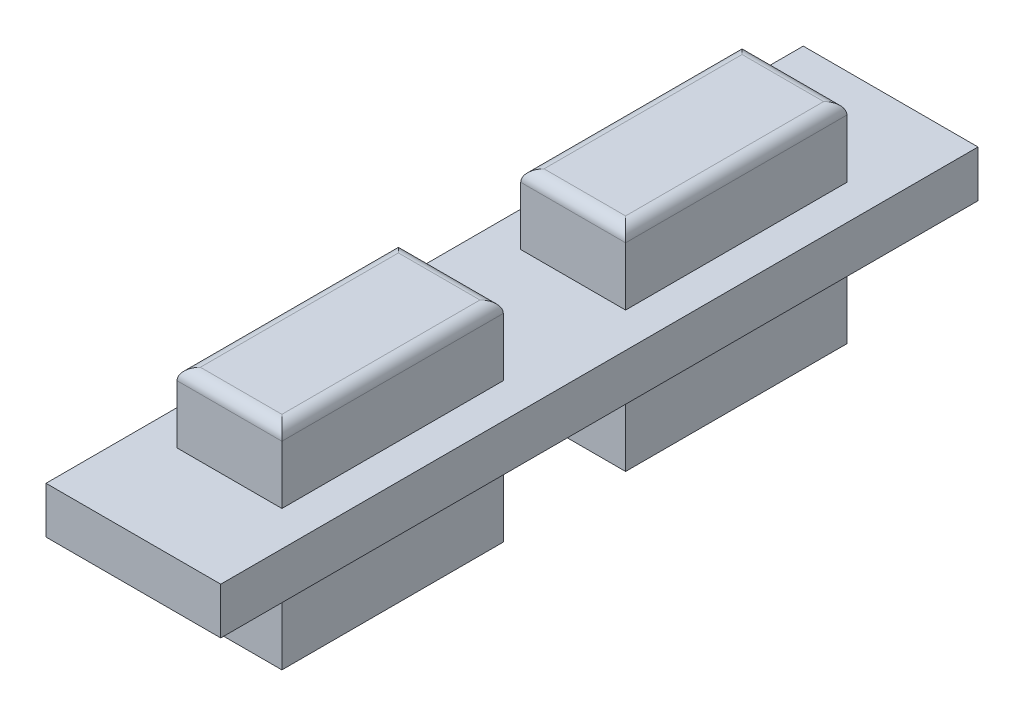
ISO-10303-21;
HEADER;
FILE_DESCRIPTION(('STEP AP214'),'2;1');
FILE_NAME('part.step','',(''),(''),'','','');
FILE_SCHEMA(('AUTOMOTIVE_DESIGN { 1 0 10303 214 1 1 1 1 }'));
ENDSEC;
DATA;
#1=APPLICATION_CONTEXT('core data for automotive mechanical design processes');
#2=APPLICATION_PROTOCOL_DEFINITION('international standard','automotive_design',2000,#1);
#3=PRODUCT_CONTEXT('',#1,'mechanical');
#4=PRODUCT('Part','Part','',(#3));
#5=PRODUCT_RELATED_PRODUCT_CATEGORY('part','',(#4));
#6=PRODUCT_DEFINITION_FORMATION('','',#4);
#7=PRODUCT_DEFINITION_CONTEXT('part definition',#1,'design');
#8=PRODUCT_DEFINITION('design','',#6,#7);
#9=PRODUCT_DEFINITION_SHAPE('','',#8);
#10=(LENGTH_UNIT() NAMED_UNIT(*) SI_UNIT(.MILLI.,.METRE.));
#11=(NAMED_UNIT(*) PLANE_ANGLE_UNIT() SI_UNIT($,.RADIAN.));
#12=(NAMED_UNIT(*) SI_UNIT($,.STERADIAN.) SOLID_ANGLE_UNIT());
#13=UNCERTAINTY_MEASURE_WITH_UNIT(LENGTH_MEASURE(1.E-05),#10,'distance_accuracy_value','');
#14=(GEOMETRIC_REPRESENTATION_CONTEXT(3) GLOBAL_UNCERTAINTY_ASSIGNED_CONTEXT((#13)) GLOBAL_UNIT_ASSIGNED_CONTEXT((#10,
#11,#12)) REPRESENTATION_CONTEXT('',''));
#15=CARTESIAN_POINT('',(0.,0.,0.));
#16=DIRECTION('',(0.,0.,1.));
#17=DIRECTION('',(1.,0.,0.));
#18=AXIS2_PLACEMENT_3D('',#15,#16,#17);
#19=CARTESIAN_POINT('',(0.,2.54,0.));
#20=DIRECTION('',(0.,-1.,0.));
#21=DIRECTION('',(0.,0.,-1.));
#22=AXIS2_PLACEMENT_3D('',#19,#20,#21);
#23=PLANE('',#22);
#24=DIRECTION('',(0.,0.,-1.));
#25=VECTOR('',#24,1.);
#26=CARTESIAN_POINT('',(-20.2947526934332,2.54,0.));
#27=LINE('',#26,#25);
#28=CARTESIAN_POINT('',(-20.2947526934332,2.54,15.5380927525385));
#29=VERTEX_POINT('',#28);
#30=CARTESIAN_POINT('',(-20.2947526934332,2.54,10.7120927525385));
#31=VERTEX_POINT('',#30);
#32=EDGE_CURVE('E267',#29,#31,#27,.T.);
#33=ORIENTED_EDGE('',*,*,#32,.T.);
#34=DIRECTION('',(-1.,0.,0.));
#35=VECTOR('',#34,1.);
#36=CARTESIAN_POINT('',(0.,2.54,10.7120927525385));
#37=LINE('',#36,#35);
#38=CARTESIAN_POINT('',(-22.5807526934332,2.54,10.7120927525385));
#39=VERTEX_POINT('',#38);
#40=EDGE_CURVE('E269',#31,#39,#37,.T.);
#41=ORIENTED_EDGE('',*,*,#40,.T.);
#42=DIRECTION('',(0.,0.,-1.));
#43=VECTOR('',#42,1.);
#44=CARTESIAN_POINT('',(-22.5807526934332,2.54,0.));
#45=LINE('',#44,#43);
#46=CARTESIAN_POINT('',(-22.5807526934332,2.54,15.5380927525385));
#47=VERTEX_POINT('',#46);
#48=EDGE_CURVE('E261',#47,#39,#45,.T.);
#49=ORIENTED_EDGE('',*,*,#48,.F.);
#50=DIRECTION('',(-1.,0.,0.));
#51=VECTOR('',#50,1.);
#52=CARTESIAN_POINT('',(0.,2.54,15.5380927525385));
#53=LINE('',#52,#51);
#54=EDGE_CURVE('E264',#29,#47,#53,.T.);
#55=ORIENTED_EDGE('',*,*,#54,.F.);
#56=EDGE_LOOP('',(#33,#41,#49,#55));
#57=FACE_BOUND('',#56,.T.);
#58=DIRECTION('',(1.,0.,0.));
#59=VECTOR('',#58,1.);
#60=CARTESIAN_POINT('',(-23.3427526934332,2.54,1.12359275253847));
#61=LINE('',#60,#59);
#62=CARTESIAN_POINT('',(-23.3427526934332,2.54,1.12359275253847));
#63=VERTEX_POINT('',#62);
#64=CARTESIAN_POINT('',(-19.5327526934332,2.54,1.12359275253847));
#65=VERTEX_POINT('',#64);
#66=EDGE_CURVE('E283',#63,#65,#61,.T.);
#67=ORIENTED_EDGE('',*,*,#66,.T.);
#68=DIRECTION('',(0.,0.,1.));
#69=VECTOR('',#68,1.);
#70=CARTESIAN_POINT('',(-19.5327526934332,2.54,1.12359275253847));
#71=LINE('',#70,#69);
#72=CARTESIAN_POINT('',(-19.5327526934332,2.54,17.6335927525385));
#73=VERTEX_POINT('',#72);
#74=EDGE_CURVE('E286',#65,#73,#71,.T.);
#75=ORIENTED_EDGE('',*,*,#74,.T.);
#76=DIRECTION('',(1.,0.,0.));
#77=VECTOR('',#76,1.);
#78=CARTESIAN_POINT('',(-23.3427526934332,2.54,17.6335927525385));
#79=LINE('',#78,#77);
#80=CARTESIAN_POINT('',(-23.3427526934332,2.54,17.6335927525385));
#81=VERTEX_POINT('',#80);
#82=EDGE_CURVE('E288',#81,#73,#79,.T.);
#83=ORIENTED_EDGE('',*,*,#82,.F.);
#84=DIRECTION('',(0.,0.,1.));
#85=VECTOR('',#84,1.);
#86=CARTESIAN_POINT('',(-23.3427526934332,2.54,1.12359275253847));
#87=LINE('',#86,#85);
#88=EDGE_CURVE('E291',#63,#81,#87,.T.);
#89=ORIENTED_EDGE('',*,*,#88,.F.);
#90=EDGE_LOOP('',(#67,#75,#83,#89));
#91=FACE_BOUND('',#90,.T.);
#92=DIRECTION('',(0.,0.,-1.));
#93=VECTOR('',#92,1.);
#94=CARTESIAN_POINT('',(-20.2947526934332,2.54,0.));
#95=LINE('',#94,#93);
#96=CARTESIAN_POINT('',(-20.2947526934332,2.54,8.04509275253847));
#97=VERTEX_POINT('',#96);
#98=CARTESIAN_POINT('',(-20.2947526934332,2.54,3.21909275253847));
#99=VERTEX_POINT('',#98);
#100=EDGE_CURVE('E230',#97,#99,#95,.T.);
#101=ORIENTED_EDGE('',*,*,#100,.T.);
#102=DIRECTION('',(-1.,0.,0.));
#103=VECTOR('',#102,1.);
#104=CARTESIAN_POINT('',(0.,2.54,3.21909275253847));
#105=LINE('',#104,#103);
#106=CARTESIAN_POINT('',(-22.5807526934332,2.54,3.21909275253847));
#107=VERTEX_POINT('',#106);
#108=EDGE_CURVE('E232',#99,#107,#105,.T.);
#109=ORIENTED_EDGE('',*,*,#108,.T.);
#110=DIRECTION('',(0.,0.,-1.));
#111=VECTOR('',#110,1.);
#112=CARTESIAN_POINT('',(-22.5807526934332,2.54,0.));
#113=LINE('',#112,#111);
#114=CARTESIAN_POINT('',(-22.5807526934332,2.54,8.04509275253847));
#115=VERTEX_POINT('',#114);
#116=EDGE_CURVE('E203',#115,#107,#113,.T.);
#117=ORIENTED_EDGE('',*,*,#116,.F.);
#118=DIRECTION('',(-1.,0.,0.));
#119=VECTOR('',#118,1.);
#120=CARTESIAN_POINT('',(0.,2.54,8.04509275253847));
#121=LINE('',#120,#119);
#122=EDGE_CURVE('E227',#97,#115,#121,.T.);
#123=ORIENTED_EDGE('',*,*,#122,.F.);
#124=EDGE_LOOP('',(#101,#109,#117,#123));
#125=FACE_BOUND('',#124,.T.);
#126=ADVANCED_FACE('F33',(#57,#91,#125),#23,.T.);
#127=CARTESIAN_POINT('',(0.,3.556,0.));
#128=DIRECTION('',(0.,-1.,0.));
#129=DIRECTION('',(0.,0.,-1.));
#130=AXIS2_PLACEMENT_3D('',#127,#128,#129);
#131=PLANE('',#130);
#132=DIRECTION('',(-1.,0.,0.));
#133=VECTOR('',#132,1.);
#134=CARTESIAN_POINT('',(0.,3.556,10.7120927525385));
#135=LINE('',#134,#133);
#136=CARTESIAN_POINT('',(-20.2947526934332,3.556,10.7120927525385));
#137=VERTEX_POINT('',#136);
#138=CARTESIAN_POINT('',(-22.5807526934332,3.556,10.7120927525385));
#139=VERTEX_POINT('',#138);
#140=EDGE_CURVE('E310',#137,#139,#135,.T.);
#141=ORIENTED_EDGE('',*,*,#140,.F.);
#142=DIRECTION('',(0.,0.,-1.));
#143=VECTOR('',#142,1.);
#144=CARTESIAN_POINT('',(-20.2947526934332,3.556,0.));
#145=LINE('',#144,#143);
#146=CARTESIAN_POINT('',(-20.2947526934332,3.556,15.5380927525385));
#147=VERTEX_POINT('',#146);
#148=EDGE_CURVE('E308',#147,#137,#145,.T.);
#149=ORIENTED_EDGE('',*,*,#148,.F.);
#150=DIRECTION('',(-1.,0.,0.));
#151=VECTOR('',#150,1.);
#152=CARTESIAN_POINT('',(0.,3.556,15.5380927525385));
#153=LINE('',#152,#151);
#154=CARTESIAN_POINT('',(-22.5807526934332,3.556,15.5380927525385));
#155=VERTEX_POINT('',#154);
#156=EDGE_CURVE('E305',#147,#155,#153,.T.);
#157=ORIENTED_EDGE('',*,*,#156,.T.);
#158=DIRECTION('',(0.,0.,-1.));
#159=VECTOR('',#158,1.);
#160=CARTESIAN_POINT('',(-22.5807526934332,3.556,0.));
#161=LINE('',#160,#159);
#162=EDGE_CURVE('E302',#155,#139,#161,.T.);
#163=ORIENTED_EDGE('',*,*,#162,.T.);
#164=EDGE_LOOP('',(#141,#149,#157,#163));
#165=FACE_BOUND('',#164,.T.);
#166=DIRECTION('',(1.,0.,0.));
#167=VECTOR('',#166,1.);
#168=CARTESIAN_POINT('',(-23.3427526934332,3.556,1.12359275253847));
#169=LINE('',#168,#167);
#170=CARTESIAN_POINT('',(-23.3427526934332,3.556,1.12359275253847));
#171=VERTEX_POINT('',#170);
#172=CARTESIAN_POINT('',(-19.5327526934332,3.556,1.12359275253847));
#173=VERTEX_POINT('',#172);
#174=EDGE_CURVE('E271',#171,#173,#169,.T.);
#175=ORIENTED_EDGE('',*,*,#174,.F.);
#176=DIRECTION('',(0.,0.,1.));
#177=VECTOR('',#176,1.);
#178=CARTESIAN_POINT('',(-23.3427526934332,3.556,1.12359275253847));
#179=LINE('',#178,#177);
#180=CARTESIAN_POINT('',(-23.3427526934332,3.556,17.6335927525385));
#181=VERTEX_POINT('',#180);
#182=EDGE_CURVE('E280',#171,#181,#179,.T.);
#183=ORIENTED_EDGE('',*,*,#182,.T.);
#184=DIRECTION('',(1.,0.,0.));
#185=VECTOR('',#184,1.);
#186=CARTESIAN_POINT('',(-23.3427526934332,3.556,17.6335927525385));
#187=LINE('',#186,#185);
#188=CARTESIAN_POINT('',(-19.5327526934332,3.556,17.6335927525385));
#189=VERTEX_POINT('',#188);
#190=EDGE_CURVE('E277',#181,#189,#187,.T.);
#191=ORIENTED_EDGE('',*,*,#190,.T.);
#192=DIRECTION('',(0.,0.,1.));
#193=VECTOR('',#192,1.);
#194=CARTESIAN_POINT('',(-19.5327526934332,3.556,1.12359275253847));
#195=LINE('',#194,#193);
#196=EDGE_CURVE('E274',#173,#189,#195,.T.);
#197=ORIENTED_EDGE('',*,*,#196,.F.);
#198=EDGE_LOOP('',(#175,#183,#191,#197));
#199=FACE_BOUND('',#198,.T.);
#200=DIRECTION('',(-1.,0.,0.));
#201=VECTOR('',#200,1.);
#202=CARTESIAN_POINT('',(0.,3.556,3.21909275253847));
#203=LINE('',#202,#201);
#204=CARTESIAN_POINT('',(-20.2947526934332,3.556,3.21909275253847));
#205=VERTEX_POINT('',#204);
#206=CARTESIAN_POINT('',(-22.5807526934332,3.556,3.21909275253847));
#207=VERTEX_POINT('',#206);
#208=EDGE_CURVE('E321',#205,#207,#203,.T.);
#209=ORIENTED_EDGE('',*,*,#208,.F.);
#210=DIRECTION('',(0.,0.,-1.));
#211=VECTOR('',#210,1.);
#212=CARTESIAN_POINT('',(-20.2947526934332,3.556,0.));
#213=LINE('',#212,#211);
#214=CARTESIAN_POINT('',(-20.2947526934332,3.556,8.04509275253847));
#215=VERTEX_POINT('',#214);
#216=EDGE_CURVE('E319',#215,#205,#213,.T.);
#217=ORIENTED_EDGE('',*,*,#216,.F.);
#218=DIRECTION('',(-1.,0.,0.));
#219=VECTOR('',#218,1.);
#220=CARTESIAN_POINT('',(0.,3.556,8.04509275253847));
#221=LINE('',#220,#219);
#222=CARTESIAN_POINT('',(-22.5807526934332,3.556,8.04509275253847));
#223=VERTEX_POINT('',#222);
#224=EDGE_CURVE('E316',#215,#223,#221,.T.);
#225=ORIENTED_EDGE('',*,*,#224,.T.);
#226=DIRECTION('',(0.,0.,-1.));
#227=VECTOR('',#226,1.);
#228=CARTESIAN_POINT('',(-22.5807526934332,3.556,0.));
#229=LINE('',#228,#227);
#230=EDGE_CURVE('E313',#223,#207,#229,.T.);
#231=ORIENTED_EDGE('',*,*,#230,.T.);
#232=EDGE_LOOP('',(#209,#217,#225,#231));
#233=FACE_BOUND('',#232,.T.);
#234=ADVANCED_FACE('F401',(#165,#199,#233),#131,.F.);
#235=CARTESIAN_POINT('',(-23.3427526934332,2.54,1.12359275253847));
#236=DIRECTION('',(0.,0.,1.));
#237=DIRECTION('',(1.,0.,0.));
#238=AXIS2_PLACEMENT_3D('',#235,#236,#237);
#239=PLANE('',#238);
#240=DIRECTION('',(0.,1.,0.));
#241=VECTOR('',#240,1.);
#242=CARTESIAN_POINT('',(-23.3427526934332,2.54,1.12359275253847));
#243=LINE('',#242,#241);
#244=EDGE_CURVE('E294',#63,#171,#243,.T.);
#245=ORIENTED_EDGE('',*,*,#244,.T.);
#246=ORIENTED_EDGE('',*,*,#174,.T.);
#247=DIRECTION('',(0.,1.,0.));
#248=VECTOR('',#247,1.);
#249=CARTESIAN_POINT('',(-19.5327526934332,2.54,1.12359275253847));
#250=LINE('',#249,#248);
#251=EDGE_CURVE('E300',#65,#173,#250,.T.);
#252=ORIENTED_EDGE('',*,*,#251,.F.);
#253=ORIENTED_EDGE('',*,*,#66,.F.);
#254=EDGE_LOOP('',(#245,#246,#252,#253));
#255=FACE_BOUND('',#254,.T.);
#256=ADVANCED_FACE('F427',(#255),#239,.F.);
#257=CARTESIAN_POINT('',(-19.5327526934332,2.54,1.12359275253847));
#258=DIRECTION('',(-1.,0.,0.));
#259=DIRECTION('',(0.,0.,1.));
#260=AXIS2_PLACEMENT_3D('',#257,#258,#259);
#261=PLANE('',#260);
#262=ORIENTED_EDGE('',*,*,#251,.T.);
#263=ORIENTED_EDGE('',*,*,#196,.T.);
#264=DIRECTION('',(0.,1.,0.));
#265=VECTOR('',#264,1.);
#266=CARTESIAN_POINT('',(-19.5327526934332,2.54,17.6335927525385));
#267=LINE('',#266,#265);
#268=EDGE_CURVE('E298',#73,#189,#267,.T.);
#269=ORIENTED_EDGE('',*,*,#268,.F.);
#270=ORIENTED_EDGE('',*,*,#74,.F.);
#271=EDGE_LOOP('',(#262,#263,#269,#270));
#272=FACE_BOUND('',#271,.T.);
#273=ADVANCED_FACE('F438',(#272),#261,.F.);
#274=CARTESIAN_POINT('',(-23.3427526934332,2.54,17.6335927525385));
#275=DIRECTION('',(0.,0.,1.));
#276=DIRECTION('',(1.,0.,0.));
#277=AXIS2_PLACEMENT_3D('',#274,#275,#276);
#278=PLANE('',#277);
#279=ORIENTED_EDGE('',*,*,#268,.T.);
#280=ORIENTED_EDGE('',*,*,#190,.F.);
#281=DIRECTION('',(0.,1.,0.));
#282=VECTOR('',#281,1.);
#283=CARTESIAN_POINT('',(-23.3427526934332,2.54,17.6335927525385));
#284=LINE('',#283,#282);
#285=EDGE_CURVE('E296',#81,#181,#284,.T.);
#286=ORIENTED_EDGE('',*,*,#285,.F.);
#287=ORIENTED_EDGE('',*,*,#82,.T.);
#288=EDGE_LOOP('',(#279,#280,#286,#287));
#289=FACE_BOUND('',#288,.T.);
#290=ADVANCED_FACE('F434',(#289),#278,.T.);
#291=CARTESIAN_POINT('',(-23.3427526934332,2.54,1.12359275253847));
#292=DIRECTION('',(-1.,0.,0.));
#293=DIRECTION('',(0.,0.,1.));
#294=AXIS2_PLACEMENT_3D('',#291,#292,#293);
#295=PLANE('',#294);
#296=ORIENTED_EDGE('',*,*,#285,.T.);
#297=ORIENTED_EDGE('',*,*,#182,.F.);
#298=ORIENTED_EDGE('',*,*,#244,.F.);
#299=ORIENTED_EDGE('',*,*,#88,.T.);
#300=EDGE_LOOP('',(#296,#297,#298,#299));
#301=FACE_BOUND('',#300,.T.);
#302=ADVANCED_FACE('F415',(#301),#295,.T.);
#303=CARTESIAN_POINT('',(0.,5.08,0.));
#304=DIRECTION('',(0.,-1.,0.));
#305=DIRECTION('',(0.,0.,-1.));
#306=AXIS2_PLACEMENT_3D('',#303,#304,#305);
#307=PLANE('',#306);
#308=DIRECTION('',(1.,0.,0.));
#309=VECTOR('',#308,1.);
#310=CARTESIAN_POINT('',(-20.2947526934332,5.08,15.2840927525385));
#311=LINE('',#310,#309);
#312=CARTESIAN_POINT('',(-22.3267526934332,5.08,15.2840927525385));
#313=VERTEX_POINT('',#312);
#314=CARTESIAN_POINT('',(-20.5487526934332,5.08,15.2840927525385));
#315=VERTEX_POINT('',#314);
#316=EDGE_CURVE('E349',#313,#315,#311,.T.);
#317=ORIENTED_EDGE('',*,*,#316,.T.);
#318=DIRECTION('',(0.,0.,1.));
#319=VECTOR('',#318,1.);
#320=CARTESIAN_POINT('',(-20.5487526934332,5.08,0.));
#321=LINE('',#320,#319);
#322=CARTESIAN_POINT('',(-20.5487526934332,5.08,10.9660927525385));
#323=VERTEX_POINT('',#322);
#324=EDGE_CURVE('E351',#315,#323,#321,.F.);
#325=ORIENTED_EDGE('',*,*,#324,.T.);
#326=DIRECTION('',(1.,0.,0.));
#327=VECTOR('',#326,1.);
#328=CARTESIAN_POINT('',(0.,5.08,10.9660927525385));
#329=LINE('',#328,#327);
#330=CARTESIAN_POINT('',(-22.3267526934332,5.08,10.9660927525385));
#331=VERTEX_POINT('',#330);
#332=EDGE_CURVE('E345',#323,#331,#329,.F.);
#333=ORIENTED_EDGE('',*,*,#332,.T.);
#334=DIRECTION('',(0.,0.,1.));
#335=VECTOR('',#334,1.);
#336=CARTESIAN_POINT('',(-22.3267526934332,5.08,15.5380927525385));
#337=LINE('',#336,#335);
#338=EDGE_CURVE('E347',#331,#313,#337,.T.);
#339=ORIENTED_EDGE('',*,*,#338,.T.);
#340=EDGE_LOOP('',(#317,#325,#333,#339));
#341=FACE_BOUND('',#340,.T.);
#342=ADVANCED_FACE('F385',(#341),#307,.F.);
#343=CARTESIAN_POINT('',(-22.5807526934332,0.508,10.7120927525385));
#344=DIRECTION('',(-1.,0.,0.));
#345=DIRECTION('',(0.,0.,1.));
#346=AXIS2_PLACEMENT_3D('',#343,#344,#345);
#347=PLANE('',#346);
#348=DIRECTION('',(0.,1.,0.));
#349=VECTOR('',#348,1.);
#350=CARTESIAN_POINT('',(-22.5807526934332,0.508,15.5380927525385));
#351=LINE('',#350,#349);
#352=CARTESIAN_POINT('',(-22.5807526934332,4.826,15.5380927525385));
#353=VERTEX_POINT('',#352);
#354=EDGE_CURVE('E249',#155,#353,#351,.T.);
#355=ORIENTED_EDGE('',*,*,#354,.T.);
#356=DIRECTION('',(0.,0.,1.));
#357=VECTOR('',#356,1.);
#358=CARTESIAN_POINT('',(-22.5807526934332,4.826,10.7120927525385));
#359=LINE('',#358,#357);
#360=CARTESIAN_POINT('',(-22.5807526934332,4.826,10.7120927525385));
#361=VERTEX_POINT('',#360);
#362=EDGE_CURVE('E42',#353,#361,#359,.F.);
#363=ORIENTED_EDGE('',*,*,#362,.T.);
#364=DIRECTION('',(0.,1.,0.));
#365=VECTOR('',#364,1.);
#366=CARTESIAN_POINT('',(-22.5807526934332,0.508,10.7120927525385));
#367=LINE('',#366,#365);
#368=EDGE_CURVE('E245',#139,#361,#367,.T.);
#369=ORIENTED_EDGE('',*,*,#368,.F.);
#370=ORIENTED_EDGE('',*,*,#162,.F.);
#371=EDGE_LOOP('',(#355,#363,#369,#370));
#372=FACE_BOUND('',#371,.T.);
#373=ADVANCED_FACE('F405',(#372),#347,.T.);
#374=CARTESIAN_POINT('',(-22.5807526934332,0.508,15.5380927525385));
#375=DIRECTION('',(0.,0.,1.));
#376=DIRECTION('',(1.,0.,0.));
#377=AXIS2_PLACEMENT_3D('',#374,#375,#376);
#378=PLANE('',#377);
#379=DIRECTION('',(0.,1.,0.));
#380=VECTOR('',#379,1.);
#381=CARTESIAN_POINT('',(-20.2947526934332,0.508,15.5380927525385));
#382=LINE('',#381,#380);
#383=CARTESIAN_POINT('',(-20.2947526934332,4.826,15.5380927525385));
#384=VERTEX_POINT('',#383);
#385=EDGE_CURVE('E253',#147,#384,#382,.T.);
#386=ORIENTED_EDGE('',*,*,#385,.T.);
#387=DIRECTION('',(1.,0.,0.));
#388=VECTOR('',#387,1.);
#389=CARTESIAN_POINT('',(-22.5807526934332,4.826,15.5380927525385));
#390=LINE('',#389,#388);
#391=EDGE_CURVE('E57',#384,#353,#390,.F.);
#392=ORIENTED_EDGE('',*,*,#391,.T.);
#393=ORIENTED_EDGE('',*,*,#354,.F.);
#394=ORIENTED_EDGE('',*,*,#156,.F.);
#395=EDGE_LOOP('',(#386,#392,#393,#394));
#396=FACE_BOUND('',#395,.T.);
#397=ADVANCED_FACE('F398',(#396),#378,.T.);
#398=CARTESIAN_POINT('',(-20.2947526934332,0.508,10.7120927525385));
#399=DIRECTION('',(-1.,0.,0.));
#400=DIRECTION('',(0.,0.,1.));
#401=AXIS2_PLACEMENT_3D('',#398,#399,#400);
#402=PLANE('',#401);
#403=DIRECTION('',(0.,1.,0.));
#404=VECTOR('',#403,1.);
#405=CARTESIAN_POINT('',(-20.2947526934332,0.508,10.7120927525385));
#406=LINE('',#405,#404);
#407=CARTESIAN_POINT('',(-20.2947526934332,4.826,10.7120927525385));
#408=VERTEX_POINT('',#407);
#409=EDGE_CURVE('E257',#137,#408,#406,.T.);
#410=ORIENTED_EDGE('',*,*,#409,.T.);
#411=DIRECTION('',(0.,0.,1.));
#412=VECTOR('',#411,1.);
#413=CARTESIAN_POINT('',(-20.2947526934332,4.826,10.7120927525385));
#414=LINE('',#413,#412);
#415=EDGE_CURVE('E342',#408,#384,#414,.T.);
#416=ORIENTED_EDGE('',*,*,#415,.T.);
#417=ORIENTED_EDGE('',*,*,#385,.F.);
#418=ORIENTED_EDGE('',*,*,#148,.T.);
#419=EDGE_LOOP('',(#410,#416,#417,#418));
#420=FACE_BOUND('',#419,.T.);
#421=ADVANCED_FACE('F395',(#420),#402,.F.);
#422=CARTESIAN_POINT('',(-22.5807526934332,0.508,10.7120927525385));
#423=DIRECTION('',(0.,0.,1.));
#424=DIRECTION('',(1.,0.,0.));
#425=AXIS2_PLACEMENT_3D('',#422,#423,#424);
#426=PLANE('',#425);
#427=ORIENTED_EDGE('',*,*,#368,.T.);
#428=DIRECTION('',(1.,0.,0.));
#429=VECTOR('',#428,1.);
#430=CARTESIAN_POINT('',(-22.5807526934332,4.826,10.7120927525385));
#431=LINE('',#430,#429);
#432=EDGE_CURVE('E11',#361,#408,#431,.T.);
#433=ORIENTED_EDGE('',*,*,#432,.T.);
#434=ORIENTED_EDGE('',*,*,#409,.F.);
#435=ORIENTED_EDGE('',*,*,#140,.T.);
#436=EDGE_LOOP('',(#427,#433,#434,#435));
#437=FACE_BOUND('',#436,.T.);
#438=ADVANCED_FACE('F404',(#437),#426,.F.);
#439=ORIENTED_EDGE('',*,*,#40,.F.);
#440=CARTESIAN_POINT('',(-20.2947526934332,0.508,10.7120927525385));
#441=VERTEX_POINT('',#440);
#442=EDGE_CURVE('E258',#441,#31,#406,.T.);
#443=ORIENTED_EDGE('',*,*,#442,.F.);
#444=DIRECTION('',(1.,0.,0.));
#445=VECTOR('',#444,1.);
#446=CARTESIAN_POINT('',(-22.5807526934332,0.508,10.7120927525385));
#447=LINE('',#446,#445);
#448=CARTESIAN_POINT('',(-22.5807526934332,0.508,10.7120927525385));
#449=VERTEX_POINT('',#448);
#450=EDGE_CURVE('E234',#449,#441,#447,.T.);
#451=ORIENTED_EDGE('',*,*,#450,.F.);
#452=EDGE_CURVE('E246',#449,#39,#367,.T.);
#453=ORIENTED_EDGE('',*,*,#452,.T.);
#454=EDGE_LOOP('',(#439,#443,#451,#453));
#455=FACE_BOUND('',#454,.T.);
#456=ADVANCED_FACE('F582',(#455),#426,.F.);
#457=ORIENTED_EDGE('',*,*,#32,.F.);
#458=CARTESIAN_POINT('',(-20.2947526934332,0.508,15.5380927525385));
#459=VERTEX_POINT('',#458);
#460=EDGE_CURVE('E254',#459,#29,#382,.T.);
#461=ORIENTED_EDGE('',*,*,#460,.F.);
#462=DIRECTION('',(0.,0.,1.));
#463=VECTOR('',#462,1.);
#464=CARTESIAN_POINT('',(-20.2947526934332,0.508,10.7120927525385));
#465=LINE('',#464,#463);
#466=EDGE_CURVE('E237',#441,#459,#465,.T.);
#467=ORIENTED_EDGE('',*,*,#466,.F.);
#468=ORIENTED_EDGE('',*,*,#442,.T.);
#469=EDGE_LOOP('',(#457,#461,#467,#468));
#470=FACE_BOUND('',#469,.T.);
#471=ADVANCED_FACE('F575',(#470),#402,.F.);
#472=ORIENTED_EDGE('',*,*,#460,.T.);
#473=ORIENTED_EDGE('',*,*,#54,.T.);
#474=CARTESIAN_POINT('',(-22.5807526934332,0.508,15.5380927525385));
#475=VERTEX_POINT('',#474);
#476=EDGE_CURVE('E250',#475,#47,#351,.T.);
#477=ORIENTED_EDGE('',*,*,#476,.F.);
#478=DIRECTION('',(1.,0.,0.));
#479=VECTOR('',#478,1.);
#480=CARTESIAN_POINT('',(-22.5807526934332,0.508,15.5380927525385));
#481=LINE('',#480,#479);
#482=EDGE_CURVE('E239',#475,#459,#481,.T.);
#483=ORIENTED_EDGE('',*,*,#482,.T.);
#484=EDGE_LOOP('',(#472,#473,#477,#483));
#485=FACE_BOUND('',#484,.T.);
#486=ADVANCED_FACE('F414',(#485),#378,.T.);
#487=ORIENTED_EDGE('',*,*,#476,.T.);
#488=ORIENTED_EDGE('',*,*,#48,.T.);
#489=ORIENTED_EDGE('',*,*,#452,.F.);
#490=DIRECTION('',(0.,0.,1.));
#491=VECTOR('',#490,1.);
#492=CARTESIAN_POINT('',(-22.5807526934332,0.508,10.7120927525385));
#493=LINE('',#492,#491);
#494=EDGE_CURVE('E242',#449,#475,#493,.T.);
#495=ORIENTED_EDGE('',*,*,#494,.T.);
#496=EDGE_LOOP('',(#487,#488,#489,#495));
#497=FACE_BOUND('',#496,.T.);
#498=ADVANCED_FACE('F408',(#497),#347,.T.);
#499=CARTESIAN_POINT('',(0.,0.508,0.));
#500=DIRECTION('',(0.,-1.,0.));
#501=DIRECTION('',(0.,0.,-1.));
#502=AXIS2_PLACEMENT_3D('',#499,#500,#501);
#503=PLANE('',#502);
#504=ORIENTED_EDGE('',*,*,#450,.T.);
#505=ORIENTED_EDGE('',*,*,#466,.T.);
#506=ORIENTED_EDGE('',*,*,#482,.F.);
#507=ORIENTED_EDGE('',*,*,#494,.F.);
#508=EDGE_LOOP('',(#504,#505,#506,#507));
#509=FACE_BOUND('',#508,.T.);
#510=ADVANCED_FACE('F419',(#509),#503,.T.);
#511=CARTESIAN_POINT('',(0.,5.08,0.));
#512=DIRECTION('',(0.,-1.,0.));
#513=DIRECTION('',(0.,0.,-1.));
#514=AXIS2_PLACEMENT_3D('',#511,#512,#513);
#515=PLANE('',#514);
#516=DIRECTION('',(1.,0.,0.));
#517=VECTOR('',#516,1.);
#518=CARTESIAN_POINT('',(-20.2947526934332,5.08,7.79109275253847));
#519=LINE('',#518,#517);
#520=CARTESIAN_POINT('',(-22.3267526934332,5.08,7.79109275253847));
#521=VERTEX_POINT('',#520);
#522=CARTESIAN_POINT('',(-20.5487526934332,5.08,7.79109275253847));
#523=VERTEX_POINT('',#522);
#524=EDGE_CURVE('E331',#521,#523,#519,.T.);
#525=ORIENTED_EDGE('',*,*,#524,.T.);
#526=DIRECTION('',(0.,0.,1.));
#527=VECTOR('',#526,1.);
#528=CARTESIAN_POINT('',(-20.5487526934332,5.08,0.));
#529=LINE('',#528,#527);
#530=CARTESIAN_POINT('',(-20.5487526934332,5.08,3.47309275253847));
#531=VERTEX_POINT('',#530);
#532=EDGE_CURVE('E333',#523,#531,#529,.F.);
#533=ORIENTED_EDGE('',*,*,#532,.T.);
#534=DIRECTION('',(1.,0.,0.));
#535=VECTOR('',#534,1.);
#536=CARTESIAN_POINT('',(0.,5.08,3.47309275253847));
#537=LINE('',#536,#535);
#538=CARTESIAN_POINT('',(-22.3267526934332,5.08,3.47309275253847));
#539=VERTEX_POINT('',#538);
#540=EDGE_CURVE('E327',#531,#539,#537,.F.);
#541=ORIENTED_EDGE('',*,*,#540,.T.);
#542=DIRECTION('',(0.,0.,1.));
#543=VECTOR('',#542,1.);
#544=CARTESIAN_POINT('',(-22.3267526934332,5.08,8.04509275253847));
#545=LINE('',#544,#543);
#546=EDGE_CURVE('E329',#539,#521,#545,.T.);
#547=ORIENTED_EDGE('',*,*,#546,.T.);
#548=EDGE_LOOP('',(#525,#533,#541,#547));
#549=FACE_BOUND('',#548,.T.);
#550=ADVANCED_FACE('F551',(#549),#515,.F.);
#551=CARTESIAN_POINT('',(-22.5807526934332,0.508,3.21909275253847));
#552=DIRECTION('',(-1.,0.,0.));
#553=DIRECTION('',(0.,0.,1.));
#554=AXIS2_PLACEMENT_3D('',#551,#552,#553);
#555=PLANE('',#554);
#556=DIRECTION('',(0.,1.,0.));
#557=VECTOR('',#556,1.);
#558=CARTESIAN_POINT('',(-22.5807526934332,0.508,8.04509275253847));
#559=LINE('',#558,#557);
#560=CARTESIAN_POINT('',(-22.5807526934332,4.826,8.04509275253847));
#561=VERTEX_POINT('',#560);
#562=EDGE_CURVE('E737',#223,#561,#559,.T.);
#563=ORIENTED_EDGE('',*,*,#562,.T.);
#564=DIRECTION('',(0.,0.,1.));
#565=VECTOR('',#564,1.);
#566=CARTESIAN_POINT('',(-22.5807526934332,4.826,3.21909275253847));
#567=LINE('',#566,#565);
#568=CARTESIAN_POINT('',(-22.5807526934332,4.826,3.21909275253847));
#569=VERTEX_POINT('',#568);
#570=EDGE_CURVE('E338',#561,#569,#567,.F.);
#571=ORIENTED_EDGE('',*,*,#570,.T.);
#572=DIRECTION('',(0.,1.,0.));
#573=VECTOR('',#572,1.);
#574=CARTESIAN_POINT('',(-22.5807526934332,0.508,3.21909275253847));
#575=LINE('',#574,#573);
#576=EDGE_CURVE('E206',#207,#569,#575,.T.);
#577=ORIENTED_EDGE('',*,*,#576,.F.);
#578=ORIENTED_EDGE('',*,*,#230,.F.);
#579=EDGE_LOOP('',(#563,#571,#577,#578));
#580=FACE_BOUND('',#579,.T.);
#581=ADVANCED_FACE('F503',(#580),#555,.T.);
#582=CARTESIAN_POINT('',(-22.5807526934332,0.508,8.04509275253847));
#583=DIRECTION('',(0.,0.,1.));
#584=DIRECTION('',(1.,0.,0.));
#585=AXIS2_PLACEMENT_3D('',#582,#583,#584);
#586=PLANE('',#585);
#587=DIRECTION('',(0.,1.,0.));
#588=VECTOR('',#587,1.);
#589=CARTESIAN_POINT('',(-20.2947526934332,0.508,8.04509275253847));
#590=LINE('',#589,#588);
#591=CARTESIAN_POINT('',(-20.2947526934332,4.826,8.04509275253847));
#592=VERTEX_POINT('',#591);
#593=EDGE_CURVE('E731',#215,#592,#590,.T.);
#594=ORIENTED_EDGE('',*,*,#593,.T.);
#595=DIRECTION('',(1.,0.,0.));
#596=VECTOR('',#595,1.);
#597=CARTESIAN_POINT('',(-22.5807526934332,4.826,8.04509275253847));
#598=LINE('',#597,#596);
#599=EDGE_CURVE('E336',#592,#561,#598,.F.);
#600=ORIENTED_EDGE('',*,*,#599,.T.);
#601=ORIENTED_EDGE('',*,*,#562,.F.);
#602=ORIENTED_EDGE('',*,*,#224,.F.);
#603=EDGE_LOOP('',(#594,#600,#601,#602));
#604=FACE_BOUND('',#603,.T.);
#605=ADVANCED_FACE('F512',(#604),#586,.T.);
#606=CARTESIAN_POINT('',(-20.2947526934332,0.508,3.21909275253847));
#607=DIRECTION('',(-1.,0.,0.));
#608=DIRECTION('',(0.,0.,1.));
#609=AXIS2_PLACEMENT_3D('',#606,#607,#608);
#610=PLANE('',#609);
#611=DIRECTION('',(0.,1.,0.));
#612=VECTOR('',#611,1.);
#613=CARTESIAN_POINT('',(-20.2947526934332,0.508,3.21909275253847));
#614=LINE('',#613,#612);
#615=CARTESIAN_POINT('',(-20.2947526934332,4.826,3.21909275253847));
#616=VERTEX_POINT('',#615);
#617=EDGE_CURVE('E366',#205,#616,#614,.T.);
#618=ORIENTED_EDGE('',*,*,#617,.T.);
#619=DIRECTION('',(0.,0.,1.));
#620=VECTOR('',#619,1.);
#621=CARTESIAN_POINT('',(-20.2947526934332,4.826,3.21909275253847));
#622=LINE('',#621,#620);
#623=EDGE_CURVE('E324',#616,#592,#622,.T.);
#624=ORIENTED_EDGE('',*,*,#623,.T.);
#625=ORIENTED_EDGE('',*,*,#593,.F.);
#626=ORIENTED_EDGE('',*,*,#216,.T.);
#627=EDGE_LOOP('',(#618,#624,#625,#626));
#628=FACE_BOUND('',#627,.T.);
#629=ADVANCED_FACE('F520',(#628),#610,.F.);
#630=CARTESIAN_POINT('',(-22.5807526934332,0.508,3.21909275253847));
#631=DIRECTION('',(0.,0.,1.));
#632=DIRECTION('',(1.,0.,0.));
#633=AXIS2_PLACEMENT_3D('',#630,#631,#632);
#634=PLANE('',#633);
#635=ORIENTED_EDGE('',*,*,#576,.T.);
#636=DIRECTION('',(1.,0.,0.));
#637=VECTOR('',#636,1.);
#638=CARTESIAN_POINT('',(-22.5807526934332,4.826,3.21909275253847));
#639=LINE('',#638,#637);
#640=EDGE_CURVE('E340',#569,#616,#639,.T.);
#641=ORIENTED_EDGE('',*,*,#640,.T.);
#642=ORIENTED_EDGE('',*,*,#617,.F.);
#643=ORIENTED_EDGE('',*,*,#208,.T.);
#644=EDGE_LOOP('',(#635,#641,#642,#643));
#645=FACE_BOUND('',#644,.T.);
#646=ADVANCED_FACE('F526',(#645),#634,.F.);
#647=ORIENTED_EDGE('',*,*,#108,.F.);
#648=CARTESIAN_POINT('',(-20.2947526934332,0.508,3.21909275253847));
#649=VERTEX_POINT('',#648);
#650=EDGE_CURVE('E213',#649,#99,#614,.T.);
#651=ORIENTED_EDGE('',*,*,#650,.F.);
#652=DIRECTION('',(1.,0.,0.));
#653=VECTOR('',#652,1.);
#654=CARTESIAN_POINT('',(-22.5807526934332,0.508,3.21909275253847));
#655=LINE('',#654,#653);
#656=CARTESIAN_POINT('',(-22.5807526934332,0.508,3.21909275253847));
#657=VERTEX_POINT('',#656);
#658=EDGE_CURVE('E210',#657,#649,#655,.T.);
#659=ORIENTED_EDGE('',*,*,#658,.F.);
#660=EDGE_CURVE('E197',#657,#107,#575,.T.);
#661=ORIENTED_EDGE('',*,*,#660,.T.);
#662=EDGE_LOOP('',(#647,#651,#659,#661));
#663=FACE_BOUND('',#662,.T.);
#664=ADVANCED_FACE('F211',(#663),#634,.F.);
#665=ORIENTED_EDGE('',*,*,#100,.F.);
#666=CARTESIAN_POINT('',(-20.2947526934332,0.508,8.04509275253847));
#667=VERTEX_POINT('',#666);
#668=EDGE_CURVE('E734',#667,#97,#590,.T.);
#669=ORIENTED_EDGE('',*,*,#668,.F.);
#670=DIRECTION('',(0.,0.,1.));
#671=VECTOR('',#670,1.);
#672=CARTESIAN_POINT('',(-20.2947526934332,0.508,3.21909275253847));
#673=LINE('',#672,#671);
#674=EDGE_CURVE('E215',#649,#667,#673,.T.);
#675=ORIENTED_EDGE('',*,*,#674,.F.);
#676=ORIENTED_EDGE('',*,*,#650,.T.);
#677=EDGE_LOOP('',(#665,#669,#675,#676));
#678=FACE_BOUND('',#677,.T.);
#679=ADVANCED_FACE('F509',(#678),#610,.F.);
#680=ORIENTED_EDGE('',*,*,#668,.T.);
#681=ORIENTED_EDGE('',*,*,#122,.T.);
#682=CARTESIAN_POINT('',(-22.5807526934332,0.508,8.04509275253847));
#683=VERTEX_POINT('',#682);
#684=EDGE_CURVE('E739',#683,#115,#559,.T.);
#685=ORIENTED_EDGE('',*,*,#684,.F.);
#686=DIRECTION('',(1.,0.,0.));
#687=VECTOR('',#686,1.);
#688=CARTESIAN_POINT('',(-22.5807526934332,0.508,8.04509275253847));
#689=LINE('',#688,#687);
#690=EDGE_CURVE('E220',#683,#667,#689,.T.);
#691=ORIENTED_EDGE('',*,*,#690,.T.);
#692=EDGE_LOOP('',(#680,#681,#685,#691));
#693=FACE_BOUND('',#692,.T.);
#694=ADVANCED_FACE('F501',(#693),#586,.T.);
#695=ORIENTED_EDGE('',*,*,#684,.T.);
#696=ORIENTED_EDGE('',*,*,#116,.T.);
#697=ORIENTED_EDGE('',*,*,#660,.F.);
#698=DIRECTION('',(0.,0.,1.));
#699=VECTOR('',#698,1.);
#700=CARTESIAN_POINT('',(-22.5807526934332,0.508,3.21909275253847));
#701=LINE('',#700,#699);
#702=EDGE_CURVE('E202',#657,#683,#701,.T.);
#703=ORIENTED_EDGE('',*,*,#702,.T.);
#704=EDGE_LOOP('',(#695,#696,#697,#703));
#705=FACE_BOUND('',#704,.T.);
#706=ADVANCED_FACE('F200',(#705),#555,.T.);
#707=CARTESIAN_POINT('',(0.,0.508,0.));
#708=DIRECTION('',(0.,-1.,0.));
#709=DIRECTION('',(0.,0.,-1.));
#710=AXIS2_PLACEMENT_3D('',#707,#708,#709);
#711=PLANE('',#710);
#712=ORIENTED_EDGE('',*,*,#658,.T.);
#713=ORIENTED_EDGE('',*,*,#674,.T.);
#714=ORIENTED_EDGE('',*,*,#690,.F.);
#715=ORIENTED_EDGE('',*,*,#702,.F.);
#716=EDGE_LOOP('',(#712,#713,#714,#715));
#717=FACE_BOUND('',#716,.T.);
#718=ADVANCED_FACE('F218',(#717),#711,.T.);
#719=CARTESIAN_POINT('',(-22.3267526934332,4.826,0.));
#720=DIRECTION('',(0.,0.,-1.));
#721=DIRECTION('',(-1.,0.,0.));
#722=AXIS2_PLACEMENT_3D('',#719,#720,#721);
#723=CYLINDRICAL_SURFACE('',#722,0.254);
#724=CARTESIAN_POINT('',(-22.3267526934332,4.826,7.79109275253847));
#725=DIRECTION('',(-0.707106781186547,0.,-0.707106781186548));
#726=DIRECTION('',(0.707106781186548,0.,-0.707106781186547));
#727=AXIS2_PLACEMENT_3D('',#724,#725,#726);
#728=ELLIPSE('',#727,0.359210244842766,0.254);
#729=EDGE_CURVE('E360',#521,#561,#728,.F.);
#730=ORIENTED_EDGE('',*,*,#729,.F.);
#731=ORIENTED_EDGE('',*,*,#546,.F.);
#732=CARTESIAN_POINT('',(-22.3267526934332,4.826,3.47309275253847));
#733=DIRECTION('',(0.707106781186548,0.,-0.707106781186547));
#734=DIRECTION('',(0.707106781186547,0.,0.707106781186548));
#735=AXIS2_PLACEMENT_3D('',#732,#733,#734);
#736=ELLIPSE('',#735,0.359210244842766,0.254);
#737=EDGE_CURVE('E363',#569,#539,#736,.T.);
#738=ORIENTED_EDGE('',*,*,#737,.F.);
#739=ORIENTED_EDGE('',*,*,#570,.F.);
#740=EDGE_LOOP('',(#730,#731,#738,#739));
#741=FACE_BOUND('',#740,.T.);
#742=ADVANCED_FACE('F457',(#741),#723,.T.);
#743=CARTESIAN_POINT('',(-22.5807526934332,4.826,3.47309275253847));
#744=DIRECTION('',(1.,0.,0.));
#745=DIRECTION('',(0.,0.,-1.));
#746=AXIS2_PLACEMENT_3D('',#743,#744,#745);
#747=CYLINDRICAL_SURFACE('',#746,0.254);
#748=ORIENTED_EDGE('',*,*,#737,.T.);
#749=ORIENTED_EDGE('',*,*,#540,.F.);
#750=CARTESIAN_POINT('',(-20.5487526934332,4.826,3.47309275253847));
#751=DIRECTION('',(0.707106781186548,0.,0.707106781186547));
#752=DIRECTION('',(0.707106781186547,0.,-0.707106781186548));
#753=AXIS2_PLACEMENT_3D('',#750,#751,#752);
#754=ELLIPSE('',#753,0.359210244842766,0.254);
#755=EDGE_CURVE('E358',#616,#531,#754,.T.);
#756=ORIENTED_EDGE('',*,*,#755,.F.);
#757=ORIENTED_EDGE('',*,*,#640,.F.);
#758=EDGE_LOOP('',(#748,#749,#756,#757));
#759=FACE_BOUND('',#758,.T.);
#760=ADVANCED_FACE('F453',(#759),#747,.T.);
#761=CARTESIAN_POINT('',(0.,4.826,7.79109275253847));
#762=DIRECTION('',(-1.,0.,0.));
#763=DIRECTION('',(0.,0.,1.));
#764=AXIS2_PLACEMENT_3D('',#761,#762,#763);
#765=CYLINDRICAL_SURFACE('',#764,0.254);
#766=ORIENTED_EDGE('',*,*,#729,.T.);
#767=ORIENTED_EDGE('',*,*,#599,.F.);
#768=CARTESIAN_POINT('',(-20.5487526934332,4.826,7.79109275253847));
#769=DIRECTION('',(-0.707106781186547,0.,0.707106781186548));
#770=DIRECTION('',(-0.707106781186548,0.,-0.707106781186547));
#771=AXIS2_PLACEMENT_3D('',#768,#769,#770);
#772=ELLIPSE('',#771,0.359210244842766,0.254);
#773=EDGE_CURVE('E356',#523,#592,#772,.F.);
#774=ORIENTED_EDGE('',*,*,#773,.F.);
#775=ORIENTED_EDGE('',*,*,#524,.F.);
#776=EDGE_LOOP('',(#766,#767,#774,#775));
#777=FACE_BOUND('',#776,.T.);
#778=ADVANCED_FACE('F449',(#777),#765,.T.);
#779=CARTESIAN_POINT('',(-20.5487526934332,4.826,3.21909275253847));
#780=DIRECTION('',(0.,0.,1.));
#781=DIRECTION('',(1.,0.,0.));
#782=AXIS2_PLACEMENT_3D('',#779,#780,#781);
#783=CYLINDRICAL_SURFACE('',#782,0.254);
#784=ORIENTED_EDGE('',*,*,#755,.T.);
#785=ORIENTED_EDGE('',*,*,#532,.F.);
#786=ORIENTED_EDGE('',*,*,#773,.T.);
#787=ORIENTED_EDGE('',*,*,#623,.F.);
#788=EDGE_LOOP('',(#784,#785,#786,#787));
#789=FACE_BOUND('',#788,.T.);
#790=ADVANCED_FACE('F446',(#789),#783,.T.);
#791=CARTESIAN_POINT('',(-22.3267526934332,4.826,0.));
#792=DIRECTION('',(0.,0.,-1.));
#793=DIRECTION('',(-1.,0.,0.));
#794=AXIS2_PLACEMENT_3D('',#791,#792,#793);
#795=CYLINDRICAL_SURFACE('',#794,0.254);
#796=CARTESIAN_POINT('',(-22.3267526934332,4.826,15.2840927525385));
#797=DIRECTION('',(-0.707106781186547,0.,-0.707106781186547));
#798=DIRECTION('',(0.707106781186547,0.,-0.707106781186547));
#799=AXIS2_PLACEMENT_3D('',#796,#797,#798);
#800=ELLIPSE('',#799,0.359210244842766,0.254);
#801=EDGE_CURVE('E370',#313,#353,#800,.F.);
#802=ORIENTED_EDGE('',*,*,#801,.F.);
#803=ORIENTED_EDGE('',*,*,#338,.F.);
#804=CARTESIAN_POINT('',(-22.3267526934332,4.826,10.9660927525385));
#805=DIRECTION('',(0.707106781186547,0.,-0.707106781186547));
#806=DIRECTION('',(0.707106781186547,0.,0.707106781186547));
#807=AXIS2_PLACEMENT_3D('',#804,#805,#806);
#808=ELLIPSE('',#807,0.359210244842766,0.254);
#809=EDGE_CURVE('E37',#361,#331,#808,.T.);
#810=ORIENTED_EDGE('',*,*,#809,.F.);
#811=ORIENTED_EDGE('',*,*,#362,.F.);
#812=EDGE_LOOP('',(#802,#803,#810,#811));
#813=FACE_BOUND('',#812,.T.);
#814=ADVANCED_FACE('F35',(#813),#795,.T.);
#815=CARTESIAN_POINT('',(-22.5807526934332,4.826,10.9660927525385));
#816=DIRECTION('',(1.,0.,0.));
#817=DIRECTION('',(0.,0.,-1.));
#818=AXIS2_PLACEMENT_3D('',#815,#816,#817);
#819=CYLINDRICAL_SURFACE('',#818,0.254);
#820=ORIENTED_EDGE('',*,*,#809,.T.);
#821=ORIENTED_EDGE('',*,*,#332,.F.);
#822=CARTESIAN_POINT('',(-20.5487526934332,4.826,10.9660927525385));
#823=DIRECTION('',(0.707106781186547,0.,0.707106781186547));
#824=DIRECTION('',(0.707106781186547,0.,-0.707106781186547));
#825=AXIS2_PLACEMENT_3D('',#822,#823,#824);
#826=ELLIPSE('',#825,0.359210244842766,0.254);
#827=EDGE_CURVE('E369',#408,#323,#826,.T.);
#828=ORIENTED_EDGE('',*,*,#827,.F.);
#829=ORIENTED_EDGE('',*,*,#432,.F.);
#830=EDGE_LOOP('',(#820,#821,#828,#829));
#831=FACE_BOUND('',#830,.T.);
#832=ADVANCED_FACE('F380',(#831),#819,.T.);
#833=CARTESIAN_POINT('',(0.,4.826,15.2840927525385));
#834=DIRECTION('',(-1.,0.,0.));
#835=DIRECTION('',(0.,0.,1.));
#836=AXIS2_PLACEMENT_3D('',#833,#834,#835);
#837=CYLINDRICAL_SURFACE('',#836,0.254);
#838=ORIENTED_EDGE('',*,*,#801,.T.);
#839=ORIENTED_EDGE('',*,*,#391,.F.);
#840=CARTESIAN_POINT('',(-20.5487526934332,4.826,15.2840927525385));
#841=DIRECTION('',(-0.707106781186547,0.,0.707106781186547));
#842=DIRECTION('',(-0.707106781186547,0.,-0.707106781186547));
#843=AXIS2_PLACEMENT_3D('',#840,#841,#842);
#844=ELLIPSE('',#843,0.359210244842766,0.254);
#845=EDGE_CURVE('E367',#315,#384,#844,.F.);
#846=ORIENTED_EDGE('',*,*,#845,.F.);
#847=ORIENTED_EDGE('',*,*,#316,.F.);
#848=EDGE_LOOP('',(#838,#839,#846,#847));
#849=FACE_BOUND('',#848,.T.);
#850=ADVANCED_FACE('F391',(#849),#837,.T.);
#851=CARTESIAN_POINT('',(-20.5487526934332,4.826,10.7120927525385));
#852=DIRECTION('',(0.,0.,1.));
#853=DIRECTION('',(1.,0.,0.));
#854=AXIS2_PLACEMENT_3D('',#851,#852,#853);
#855=CYLINDRICAL_SURFACE('',#854,0.254);
#856=ORIENTED_EDGE('',*,*,#827,.T.);
#857=ORIENTED_EDGE('',*,*,#324,.F.);
#858=ORIENTED_EDGE('',*,*,#845,.T.);
#859=ORIENTED_EDGE('',*,*,#415,.F.);
#860=EDGE_LOOP('',(#856,#857,#858,#859));
#861=FACE_BOUND('',#860,.T.);
#862=ADVANCED_FACE('F389',(#861),#855,.T.);
#863=CLOSED_SHELL('',(#126,#234,#256,#273,#290,#302,#342,#373,#397,#421,#438,#456,#471,#486,
#498,#510,#550,#581,#605,#629,#646,#664,#679,#694,#706,#718,#742,#760,#778,#790,#814,#832,#850,#862));
#864=MANIFOLD_SOLID_BREP('B2',#863);
#865=ADVANCED_BREP_SHAPE_REPRESENTATION('',(#18,#864),#14);
#866=SHAPE_DEFINITION_REPRESENTATION(#9,#865);
ENDSEC;
END-ISO-10303-21;
